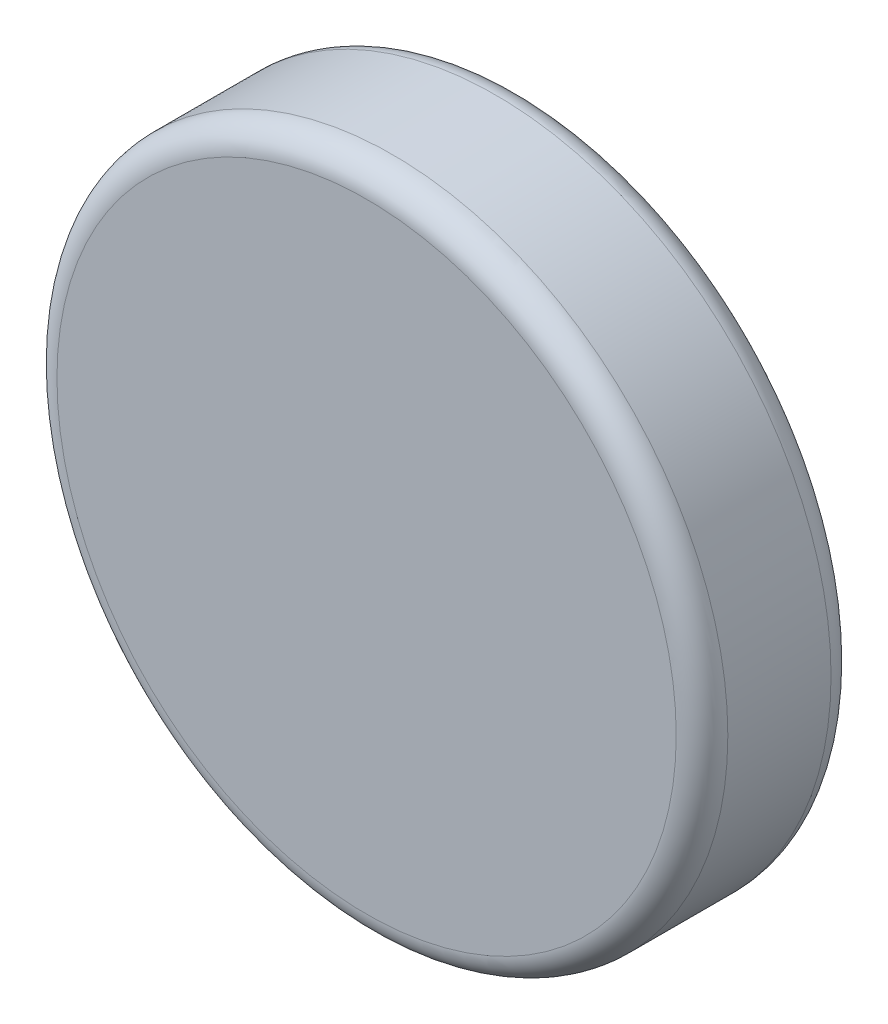
ISO-10303-21;
HEADER;
FILE_DESCRIPTION(('STEP AP214'),'2;1');
FILE_NAME('part.step','',(''),(''),'','','');
FILE_SCHEMA(('AUTOMOTIVE_DESIGN { 1 0 10303 214 1 1 1 1 }'));
ENDSEC;
DATA;
#1=APPLICATION_CONTEXT('core data for automotive mechanical design processes');
#2=APPLICATION_PROTOCOL_DEFINITION('international standard','automotive_design',2000,#1);
#3=PRODUCT_CONTEXT('',#1,'mechanical');
#4=PRODUCT('Part','Part','',(#3));
#5=PRODUCT_RELATED_PRODUCT_CATEGORY('part','',(#4));
#6=PRODUCT_DEFINITION_FORMATION('','',#4);
#7=PRODUCT_DEFINITION_CONTEXT('part definition',#1,'design');
#8=PRODUCT_DEFINITION('design','',#6,#7);
#9=PRODUCT_DEFINITION_SHAPE('','',#8);
#10=(LENGTH_UNIT() NAMED_UNIT(*) SI_UNIT(.MILLI.,.METRE.));
#11=(NAMED_UNIT(*) PLANE_ANGLE_UNIT() SI_UNIT($,.RADIAN.));
#12=(NAMED_UNIT(*) SI_UNIT($,.STERADIAN.) SOLID_ANGLE_UNIT());
#13=UNCERTAINTY_MEASURE_WITH_UNIT(LENGTH_MEASURE(1.E-05),#10,'distance_accuracy_value','');
#14=(GEOMETRIC_REPRESENTATION_CONTEXT(3) GLOBAL_UNCERTAINTY_ASSIGNED_CONTEXT((#13)) GLOBAL_UNIT_ASSIGNED_CONTEXT((#10,
#11,#12)) REPRESENTATION_CONTEXT('',''));
#15=CARTESIAN_POINT('',(0.,0.,0.));
#16=DIRECTION('',(0.,0.,1.));
#17=DIRECTION('',(1.,0.,0.));
#18=AXIS2_PLACEMENT_3D('',#15,#16,#17);
#19=CARTESIAN_POINT('',(0.,0.,6.));
#20=DIRECTION('',(0.,0.,-1.));
#21=DIRECTION('',(-1.,0.,0.));
#22=AXIS2_PLACEMENT_3D('',#19,#20,#21);
#23=CYLINDRICAL_SURFACE('',#22,13.);
#24=CARTESIAN_POINT('',(0.,0.,5.));
#25=DIRECTION('',(0.,0.,1.));
#26=DIRECTION('',(1.,0.,0.));
#27=AXIS2_PLACEMENT_3D('',#24,#25,#26);
#28=CIRCLE('',#27,13.);
#29=CARTESIAN_POINT('',(13.,0.,5.));
#30=VERTEX_POINT('',#29);
#31=EDGE_CURVE('E69',#30,#30,#28,.F.);
#32=ORIENTED_EDGE('',*,*,#31,.T.);
#33=EDGE_LOOP('',(#32));
#34=FACE_BOUND('',#33,.T.);
#35=CARTESIAN_POINT('',(0.,0.,1.));
#36=DIRECTION('',(0.,0.,1.));
#37=DIRECTION('',(1.,0.,0.));
#38=AXIS2_PLACEMENT_3D('',#35,#36,#37);
#39=CIRCLE('',#38,13.);
#40=CARTESIAN_POINT('',(13.,0.,1.));
#41=VERTEX_POINT('',#40);
#42=EDGE_CURVE('E82',#41,#41,#39,.T.);
#43=ORIENTED_EDGE('',*,*,#42,.T.);
#44=EDGE_LOOP('',(#43));
#45=FACE_BOUND('',#44,.T.);
#46=ADVANCED_FACE('F37',(#34,#45),#23,.T.);
#47=CARTESIAN_POINT('',(0.,0.,6.));
#48=DIRECTION('',(0.,0.,1.));
#49=DIRECTION('',(1.,0.,0.));
#50=AXIS2_PLACEMENT_3D('',#47,#48,#49);
#51=PLANE('',#50);
#52=CARTESIAN_POINT('',(0.,0.,6.));
#53=DIRECTION('',(0.,0.,1.));
#54=DIRECTION('',(1.,0.,0.));
#55=AXIS2_PLACEMENT_3D('',#52,#53,#54);
#56=CIRCLE('',#55,12.);
#57=CARTESIAN_POINT('',(12.,0.,6.));
#58=VERTEX_POINT('',#57);
#59=EDGE_CURVE('E72',#58,#58,#56,.T.);
#60=ORIENTED_EDGE('',*,*,#59,.T.);
#61=EDGE_LOOP('',(#60));
#62=FACE_BOUND('',#61,.T.);
#63=ADVANCED_FACE('F106',(#62),#51,.T.);
#64=CARTESIAN_POINT('',(0.,0.,4.));
#65=DIRECTION('',(0.,0.,-1.));
#66=DIRECTION('',(-1.,0.,0.));
#67=AXIS2_PLACEMENT_3D('',#64,#65,#66);
#68=CYLINDRICAL_SURFACE('',#67,11.);
#69=CARTESIAN_POINT('',(0.,0.,3.8));
#70=DIRECTION('',(0.,0.,-1.));
#71=DIRECTION('',(-1.,0.,0.));
#72=AXIS2_PLACEMENT_3D('',#69,#70,#71);
#73=CIRCLE('',#72,11.);
#74=CARTESIAN_POINT('',(-11.,0.,3.8));
#75=VERTEX_POINT('',#74);
#76=EDGE_CURVE('E44',#75,#75,#73,.F.);
#77=ORIENTED_EDGE('',*,*,#76,.T.);
#78=EDGE_LOOP('',(#77));
#79=FACE_BOUND('',#78,.T.);
#80=CARTESIAN_POINT('',(0.,0.,1.));
#81=DIRECTION('',(0.,0.,1.));
#82=DIRECTION('',(1.,0.,0.));
#83=AXIS2_PLACEMENT_3D('',#80,#81,#82);
#84=CIRCLE('',#83,11.);
#85=CARTESIAN_POINT('',(11.,0.,1.));
#86=VERTEX_POINT('',#85);
#87=EDGE_CURVE('E75',#86,#86,#84,.F.);
#88=ORIENTED_EDGE('',*,*,#87,.T.);
#89=EDGE_LOOP('',(#88));
#90=FACE_BOUND('',#89,.T.);
#91=ADVANCED_FACE('F112',(#79,#90),#68,.F.);
#92=CARTESIAN_POINT('',(0.,0.,4.));
#93=DIRECTION('',(0.,0.,-1.));
#94=DIRECTION('',(-1.,0.,0.));
#95=AXIS2_PLACEMENT_3D('',#92,#93,#94);
#96=PLANE('',#95);
#97=CARTESIAN_POINT('',(0.,0.,4.));
#98=DIRECTION('',(0.,0.,-1.));
#99=DIRECTION('',(-1.,0.,0.));
#100=AXIS2_PLACEMENT_3D('',#97,#98,#99);
#101=CIRCLE('',#100,10.8);
#102=CARTESIAN_POINT('',(-10.8,0.,4.));
#103=VERTEX_POINT('',#102);
#104=EDGE_CURVE('E48',#103,#103,#101,.T.);
#105=ORIENTED_EDGE('',*,*,#104,.T.);
#106=EDGE_LOOP('',(#105));
#107=FACE_BOUND('',#106,.T.);
#108=CARTESIAN_POINT('',(0.,0.,4.));
#109=DIRECTION('',(0.,0.,-1.));
#110=DIRECTION('',(-1.,0.,0.));
#111=AXIS2_PLACEMENT_3D('',#108,#109,#110);
#112=CIRCLE('',#111,2.7);
#113=CARTESIAN_POINT('',(-2.7,0.,4.));
#114=VERTEX_POINT('',#113);
#115=EDGE_CURVE('E52',#114,#114,#112,.F.);
#116=ORIENTED_EDGE('',*,*,#115,.T.);
#117=EDGE_LOOP('',(#116));
#118=FACE_BOUND('',#117,.T.);
#119=ADVANCED_FACE('F144',(#107,#118),#96,.T.);
#120=CARTESIAN_POINT('',(0.,0.,4.));
#121=DIRECTION('',(0.,0.,-1.));
#122=DIRECTION('',(-1.,0.,0.));
#123=AXIS2_PLACEMENT_3D('',#120,#121,#122);
#124=CYLINDRICAL_SURFACE('',#123,2.5);
#125=CARTESIAN_POINT('',(0.,0.,3.8));
#126=DIRECTION('',(0.,0.,-1.));
#127=DIRECTION('',(-1.,0.,0.));
#128=AXIS2_PLACEMENT_3D('',#125,#126,#127);
#129=CIRCLE('',#128,2.5);
#130=CARTESIAN_POINT('',(-2.5,0.,3.8));
#131=VERTEX_POINT('',#130);
#132=EDGE_CURVE('E11',#131,#131,#129,.T.);
#133=ORIENTED_EDGE('',*,*,#132,.T.);
#134=EDGE_LOOP('',(#133));
#135=FACE_BOUND('',#134,.T.);
#136=CARTESIAN_POINT('',(0.,0.,0.2));
#137=DIRECTION('',(0.,0.,1.));
#138=DIRECTION('',(1.,0.,0.));
#139=AXIS2_PLACEMENT_3D('',#136,#137,#138);
#140=CIRCLE('',#139,2.5);
#141=CARTESIAN_POINT('',(2.5,0.,0.2));
#142=VERTEX_POINT('',#141);
#143=EDGE_CURVE('E60',#142,#142,#140,.T.);
#144=ORIENTED_EDGE('',*,*,#143,.T.);
#145=EDGE_LOOP('',(#144));
#146=FACE_BOUND('',#145,.T.);
#147=ADVANCED_FACE('F102',(#135,#146),#124,.T.);
#148=CARTESIAN_POINT('',(0.,0.,4.));
#149=DIRECTION('',(0.,0.,-1.));
#150=DIRECTION('',(-1.,0.,0.));
#151=AXIS2_PLACEMENT_3D('',#148,#149,#150);
#152=PLANE('',#151);
#153=CARTESIAN_POINT('',(0.,0.,4.));
#154=DIRECTION('',(0.,0.,-1.));
#155=DIRECTION('',(-1.,0.,0.));
#156=AXIS2_PLACEMENT_3D('',#153,#154,#155);
#157=CIRCLE('',#156,0.725);
#158=CARTESIAN_POINT('',(-0.725,0.,4.));
#159=VERTEX_POINT('',#158);
#160=EDGE_CURVE('E79',#159,#159,#157,.T.);
#161=ORIENTED_EDGE('',*,*,#160,.T.);
#162=EDGE_LOOP('',(#161));
#163=FACE_BOUND('',#162,.T.);
#164=ADVANCED_FACE('F88',(#163),#152,.T.);
#165=CARTESIAN_POINT('',(0.,0.,4.));
#166=DIRECTION('',(0.,0.,-1.));
#167=DIRECTION('',(-1.,0.,0.));
#168=AXIS2_PLACEMENT_3D('',#165,#166,#167);
#169=CYLINDRICAL_SURFACE('',#168,0.725);
#170=CARTESIAN_POINT('',(0.,0.,0.2));
#171=DIRECTION('',(0.,0.,1.));
#172=DIRECTION('',(1.,0.,0.));
#173=AXIS2_PLACEMENT_3D('',#170,#171,#172);
#174=CIRCLE('',#173,0.725);
#175=CARTESIAN_POINT('',(0.725,0.,0.2));
#176=VERTEX_POINT('',#175);
#177=EDGE_CURVE('E57',#176,#176,#174,.F.);
#178=ORIENTED_EDGE('',*,*,#177,.T.);
#179=EDGE_LOOP('',(#178));
#180=FACE_BOUND('',#179,.T.);
#181=ORIENTED_EDGE('',*,*,#160,.F.);
#182=EDGE_LOOP('',(#181));
#183=FACE_BOUND('',#182,.T.);
#184=ADVANCED_FACE('F90',(#180,#183),#169,.F.);
#185=CARTESIAN_POINT('',(0.,0.,0.));
#186=DIRECTION('',(0.,0.,1.));
#187=DIRECTION('',(1.,0.,0.));
#188=AXIS2_PLACEMENT_3D('',#185,#186,#187);
#189=PLANE('',#188);
#190=CARTESIAN_POINT('',(0.,0.,0.));
#191=DIRECTION('',(0.,0.,1.));
#192=DIRECTION('',(1.,0.,0.));
#193=AXIS2_PLACEMENT_3D('',#190,#191,#192);
#194=CIRCLE('',#193,2.3);
#195=CARTESIAN_POINT('',(2.3,0.,0.));
#196=VERTEX_POINT('',#195);
#197=EDGE_CURVE('E63',#196,#196,#194,.F.);
#198=ORIENTED_EDGE('',*,*,#197,.T.);
#199=EDGE_LOOP('',(#198));
#200=FACE_BOUND('',#199,.T.);
#201=CARTESIAN_POINT('',(0.,0.,0.));
#202=DIRECTION('',(0.,0.,1.));
#203=DIRECTION('',(1.,0.,0.));
#204=AXIS2_PLACEMENT_3D('',#201,#202,#203);
#205=CIRCLE('',#204,0.925);
#206=CARTESIAN_POINT('',(0.925,0.,0.));
#207=VERTEX_POINT('',#206);
#208=EDGE_CURVE('E66',#207,#207,#205,.T.);
#209=ORIENTED_EDGE('',*,*,#208,.T.);
#210=EDGE_LOOP('',(#209));
#211=FACE_BOUND('',#210,.T.);
#212=ADVANCED_FACE('F92',(#200,#211),#189,.F.);
#213=CARTESIAN_POINT('',(0.,0.,1.));
#214=DIRECTION('',(0.,0.,1.));
#215=DIRECTION('',(1.,0.,0.));
#216=AXIS2_PLACEMENT_3D('',#213,#214,#215);
#217=TOROIDAL_SURFACE('',#216,12.,1.);
#218=ORIENTED_EDGE('',*,*,#87,.F.);
#219=EDGE_LOOP('',(#218));
#220=FACE_BOUND('',#219,.T.);
#221=CARTESIAN_POINT('',(0.,0.,0.));
#222=DIRECTION('',(0.,0.,1.));
#223=DIRECTION('',(1.,0.,0.));
#224=AXIS2_PLACEMENT_3D('',#221,#222,#223);
#225=CIRCLE('',#224,12.);
#226=CARTESIAN_POINT('',(12.,0.,0.));
#227=VERTEX_POINT('',#226);
#228=EDGE_CURVE('E76',#227,#227,#225,.T.);
#229=ORIENTED_EDGE('',*,*,#228,.F.);
#230=EDGE_LOOP('',(#229));
#231=FACE_BOUND('',#230,.T.);
#232=ADVANCED_FACE('F99',(#220,#231),#217,.T.);
#233=CARTESIAN_POINT('',(0.,0.,1.));
#234=DIRECTION('',(0.,0.,1.));
#235=DIRECTION('',(1.,0.,0.));
#236=AXIS2_PLACEMENT_3D('',#233,#234,#235);
#237=TOROIDAL_SURFACE('',#236,12.,1.);
#238=ORIENTED_EDGE('',*,*,#228,.T.);
#239=EDGE_LOOP('',(#238));
#240=FACE_BOUND('',#239,.T.);
#241=ORIENTED_EDGE('',*,*,#42,.F.);
#242=EDGE_LOOP('',(#241));
#243=FACE_BOUND('',#242,.T.);
#244=ADVANCED_FACE('F116',(#240,#243),#237,.T.);
#245=CARTESIAN_POINT('',(0.,0.,5.));
#246=DIRECTION('',(0.,0.,1.));
#247=DIRECTION('',(1.,0.,0.));
#248=AXIS2_PLACEMENT_3D('',#245,#246,#247);
#249=TOROIDAL_SURFACE('',#248,12.,1.);
#250=ORIENTED_EDGE('',*,*,#31,.F.);
#251=EDGE_LOOP('',(#250));
#252=FACE_BOUND('',#251,.T.);
#253=ORIENTED_EDGE('',*,*,#59,.F.);
#254=EDGE_LOOP('',(#253));
#255=FACE_BOUND('',#254,.T.);
#256=ADVANCED_FACE('F119',(#252,#255),#249,.T.);
#257=CARTESIAN_POINT('',(0.,0.,0.2));
#258=DIRECTION('',(0.,0.,1.));
#259=DIRECTION('',(1.,0.,0.));
#260=AXIS2_PLACEMENT_3D('',#257,#258,#259);
#261=TOROIDAL_SURFACE('',#260,2.3,0.2);
#262=ORIENTED_EDGE('',*,*,#143,.F.);
#263=EDGE_LOOP('',(#262));
#264=FACE_BOUND('',#263,.T.);
#265=ORIENTED_EDGE('',*,*,#197,.F.);
#266=EDGE_LOOP('',(#265));
#267=FACE_BOUND('',#266,.T.);
#268=ADVANCED_FACE('F126',(#264,#267),#261,.T.);
#269=CARTESIAN_POINT('',(0.,0.,0.2));
#270=DIRECTION('',(0.,0.,1.));
#271=DIRECTION('',(1.,0.,0.));
#272=AXIS2_PLACEMENT_3D('',#269,#270,#271);
#273=TOROIDAL_SURFACE('',#272,0.925,0.2);
#274=ORIENTED_EDGE('',*,*,#208,.F.);
#275=EDGE_LOOP('',(#274));
#276=FACE_BOUND('',#275,.T.);
#277=ORIENTED_EDGE('',*,*,#177,.F.);
#278=EDGE_LOOP('',(#277));
#279=FACE_BOUND('',#278,.T.);
#280=ADVANCED_FACE('F130',(#276,#279),#273,.T.);
#281=CARTESIAN_POINT('',(0.,0.,3.8));
#282=DIRECTION('',(0.,0.,-1.));
#283=DIRECTION('',(-1.,0.,0.));
#284=AXIS2_PLACEMENT_3D('',#281,#282,#283);
#285=TOROIDAL_SURFACE('',#284,10.8,0.2);
#286=ORIENTED_EDGE('',*,*,#76,.F.);
#287=EDGE_LOOP('',(#286));
#288=FACE_BOUND('',#287,.T.);
#289=ORIENTED_EDGE('',*,*,#104,.F.);
#290=EDGE_LOOP('',(#289));
#291=FACE_BOUND('',#290,.T.);
#292=ADVANCED_FACE('F133',(#288,#291),#285,.F.);
#293=CARTESIAN_POINT('',(0.,0.,3.8));
#294=DIRECTION('',(0.,0.,-1.));
#295=DIRECTION('',(-1.,0.,0.));
#296=AXIS2_PLACEMENT_3D('',#293,#294,#295);
#297=TOROIDAL_SURFACE('',#296,2.7,0.2);
#298=ORIENTED_EDGE('',*,*,#115,.F.);
#299=EDGE_LOOP('',(#298));
#300=FACE_BOUND('',#299,.T.);
#301=ORIENTED_EDGE('',*,*,#132,.F.);
#302=EDGE_LOOP('',(#301));
#303=FACE_BOUND('',#302,.T.);
#304=ADVANCED_FACE('F39',(#300,#303),#297,.F.);
#305=CLOSED_SHELL('',(#46,#63,#91,#119,#147,#164,#184,#212,#232,#244,#256,#268,#280,#292,#304));
#306=MANIFOLD_SOLID_BREP('B2',#305);
#307=ADVANCED_BREP_SHAPE_REPRESENTATION('',(#18,#306),#14);
#308=SHAPE_DEFINITION_REPRESENTATION(#9,#307);
ENDSEC;
END-ISO-10303-21;
